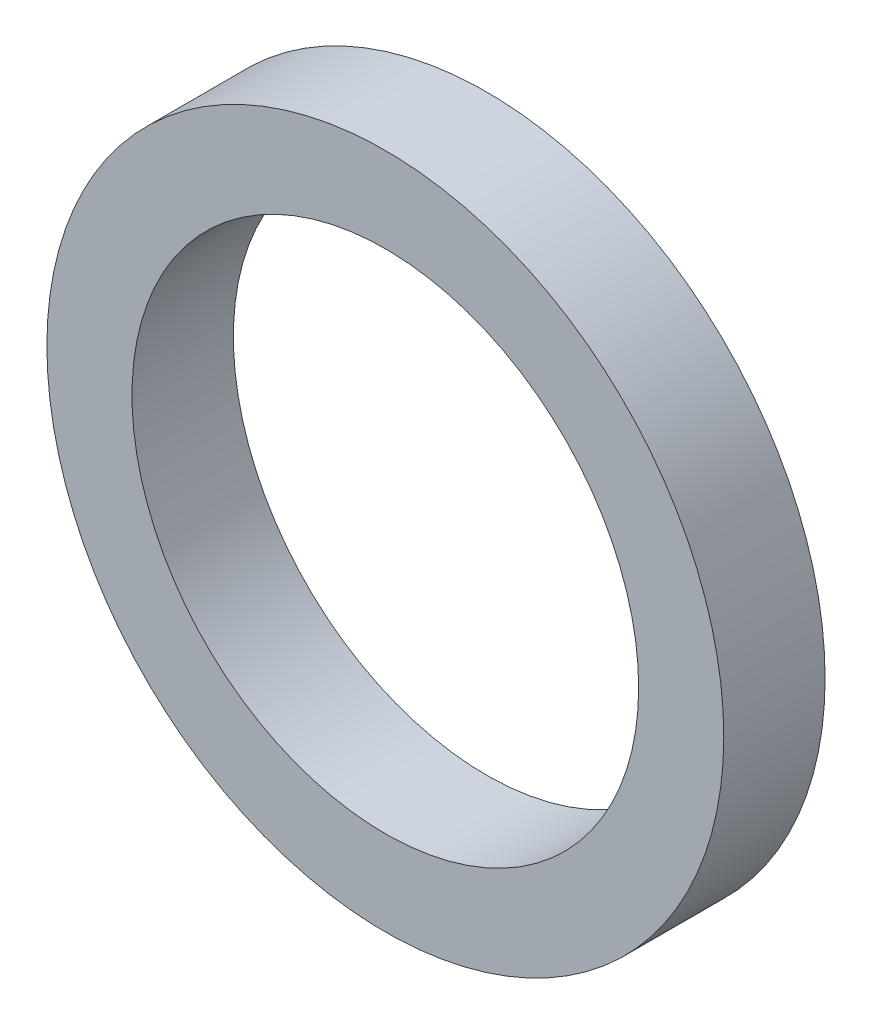
ISO-10303-21;
HEADER;
FILE_DESCRIPTION(('STEP AP214'),'2;1');
FILE_NAME('part.step','',(''),(''),'','','');
FILE_SCHEMA(('AUTOMOTIVE_DESIGN { 1 0 10303 214 1 1 1 1 }'));
ENDSEC;
DATA;
#1=APPLICATION_CONTEXT('core data for automotive mechanical design processes');
#2=APPLICATION_PROTOCOL_DEFINITION('international standard','automotive_design',2000,#1);
#3=PRODUCT_CONTEXT('',#1,'mechanical');
#4=PRODUCT('Part','Part','',(#3));
#5=PRODUCT_RELATED_PRODUCT_CATEGORY('part','',(#4));
#6=PRODUCT_DEFINITION_FORMATION('','',#4);
#7=PRODUCT_DEFINITION_CONTEXT('part definition',#1,'design');
#8=PRODUCT_DEFINITION('design','',#6,#7);
#9=PRODUCT_DEFINITION_SHAPE('','',#8);
#10=(LENGTH_UNIT() NAMED_UNIT(*) SI_UNIT(.MILLI.,.METRE.));
#11=(NAMED_UNIT(*) PLANE_ANGLE_UNIT() SI_UNIT($,.RADIAN.));
#12=(NAMED_UNIT(*) SI_UNIT($,.STERADIAN.) SOLID_ANGLE_UNIT());
#13=UNCERTAINTY_MEASURE_WITH_UNIT(LENGTH_MEASURE(1.E-05),#10,'distance_accuracy_value','');
#14=(GEOMETRIC_REPRESENTATION_CONTEXT(3) GLOBAL_UNCERTAINTY_ASSIGNED_CONTEXT((#13)) GLOBAL_UNIT_ASSIGNED_CONTEXT((#10,
#11,#12)) REPRESENTATION_CONTEXT('',''));
#15=CARTESIAN_POINT('',(0.,0.,0.));
#16=DIRECTION('',(0.,0.,1.));
#17=DIRECTION('',(1.,0.,0.));
#18=AXIS2_PLACEMENT_3D('',#15,#16,#17);
#19=CARTESIAN_POINT('',(0.,0.,0.5));
#20=DIRECTION('',(0.,0.,1.));
#21=DIRECTION('',(1.,0.,0.));
#22=AXIS2_PLACEMENT_3D('',#19,#20,#21);
#23=PLANE('',#22);
#24=CARTESIAN_POINT('',(0.,0.,0.5));
#25=DIRECTION('',(0.,0.,1.));
#26=DIRECTION('',(1.,0.,0.));
#27=AXIS2_PLACEMENT_3D('',#24,#25,#26);
#28=CIRCLE('',#27,2.5);
#29=CARTESIAN_POINT('',(2.5,0.,0.5));
#30=VERTEX_POINT('',#29);
#31=EDGE_CURVE('E27',#30,#30,#28,.F.);
#32=ORIENTED_EDGE('',*,*,#31,.T.);
#33=EDGE_LOOP('',(#32));
#34=FACE_BOUND('',#33,.T.);
#35=CARTESIAN_POINT('',(0.,0.,0.5));
#36=DIRECTION('',(0.,0.,1.));
#37=DIRECTION('',(1.,0.,0.));
#38=AXIS2_PLACEMENT_3D('',#35,#36,#37);
#39=CIRCLE('',#38,3.34);
#40=CARTESIAN_POINT('',(3.34,0.,0.5));
#41=VERTEX_POINT('',#40);
#42=EDGE_CURVE('E18',#41,#41,#39,.F.);
#43=ORIENTED_EDGE('',*,*,#42,.F.);
#44=EDGE_LOOP('',(#43));
#45=FACE_BOUND('',#44,.T.);
#46=ADVANCED_FACE('F15',(#34,#45),#23,.T.);
#47=CARTESIAN_POINT('',(0.,0.,-0.5));
#48=DIRECTION('',(0.,0.,1.));
#49=DIRECTION('',(1.,0.,0.));
#50=AXIS2_PLACEMENT_3D('',#47,#48,#49);
#51=CYLINDRICAL_SURFACE('',#50,3.34);
#52=ORIENTED_EDGE('',*,*,#42,.T.);
#53=EDGE_LOOP('',(#52));
#54=FACE_BOUND('',#53,.T.);
#55=CARTESIAN_POINT('',(0.,0.,-0.5));
#56=DIRECTION('',(0.,0.,1.));
#57=DIRECTION('',(1.,0.,0.));
#58=AXIS2_PLACEMENT_3D('',#55,#56,#57);
#59=CIRCLE('',#58,3.34);
#60=CARTESIAN_POINT('',(3.34,0.,-0.5));
#61=VERTEX_POINT('',#60);
#62=EDGE_CURVE('E22',#61,#61,#59,.T.);
#63=ORIENTED_EDGE('',*,*,#62,.T.);
#64=EDGE_LOOP('',(#63));
#65=FACE_BOUND('',#64,.T.);
#66=ADVANCED_FACE('F35',(#54,#65),#51,.T.);
#67=CARTESIAN_POINT('',(0.,0.,-0.5));
#68=DIRECTION('',(0.,0.,1.));
#69=DIRECTION('',(1.,0.,0.));
#70=AXIS2_PLACEMENT_3D('',#67,#68,#69);
#71=CYLINDRICAL_SURFACE('',#70,2.5);
#72=ORIENTED_EDGE('',*,*,#31,.F.);
#73=EDGE_LOOP('',(#72));
#74=FACE_BOUND('',#73,.T.);
#75=CARTESIAN_POINT('',(0.,0.,-0.5));
#76=DIRECTION('',(0.,0.,1.));
#77=DIRECTION('',(1.,0.,0.));
#78=AXIS2_PLACEMENT_3D('',#75,#76,#77);
#79=CIRCLE('',#78,2.5);
#80=CARTESIAN_POINT('',(2.5,0.,-0.5));
#81=VERTEX_POINT('',#80);
#82=EDGE_CURVE('E10',#81,#81,#79,.F.);
#83=ORIENTED_EDGE('',*,*,#82,.T.);
#84=EDGE_LOOP('',(#83));
#85=FACE_BOUND('',#84,.T.);
#86=ADVANCED_FACE('F43',(#74,#85),#71,.F.);
#87=CARTESIAN_POINT('',(0.,0.,-0.5));
#88=DIRECTION('',(0.,0.,1.));
#89=DIRECTION('',(1.,0.,0.));
#90=AXIS2_PLACEMENT_3D('',#87,#88,#89);
#91=PLANE('',#90);
#92=ORIENTED_EDGE('',*,*,#82,.F.);
#93=EDGE_LOOP('',(#92));
#94=FACE_BOUND('',#93,.T.);
#95=ORIENTED_EDGE('',*,*,#62,.F.);
#96=EDGE_LOOP('',(#95));
#97=FACE_BOUND('',#96,.T.);
#98=ADVANCED_FACE('F44',(#94,#97),#91,.F.);
#99=CLOSED_SHELL('',(#46,#66,#86,#98));
#100=MANIFOLD_SOLID_BREP('B1',#99);
#101=ADVANCED_BREP_SHAPE_REPRESENTATION('',(#18,#100),#14);
#102=SHAPE_DEFINITION_REPRESENTATION(#9,#101);
ENDSEC;
END-ISO-10303-21;
